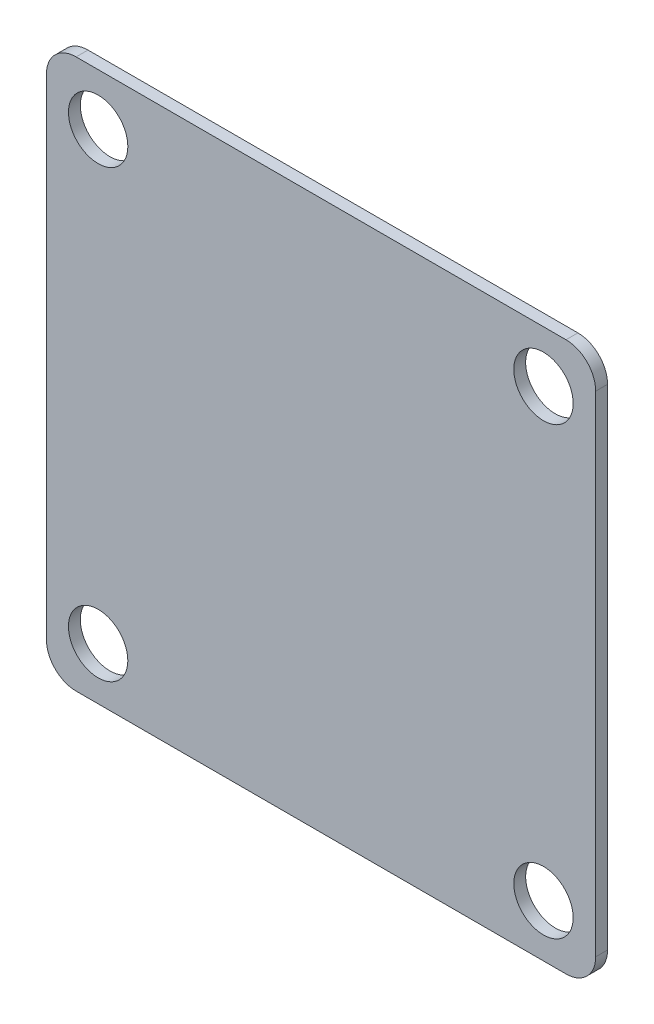
ISO-10303-21;
HEADER;
FILE_DESCRIPTION(('STEP AP214'),'2;1');
FILE_NAME('part.step','',(''),(''),'','','');
FILE_SCHEMA(('AUTOMOTIVE_DESIGN { 1 0 10303 214 1 1 1 1 }'));
ENDSEC;
DATA;
#1=APPLICATION_CONTEXT('core data for automotive mechanical design processes');
#2=APPLICATION_PROTOCOL_DEFINITION('international standard','automotive_design',2000,#1);
#3=PRODUCT_CONTEXT('',#1,'mechanical');
#4=PRODUCT('Part','Part','',(#3));
#5=PRODUCT_RELATED_PRODUCT_CATEGORY('part','',(#4));
#6=PRODUCT_DEFINITION_FORMATION('','',#4);
#7=PRODUCT_DEFINITION_CONTEXT('part definition',#1,'design');
#8=PRODUCT_DEFINITION('design','',#6,#7);
#9=PRODUCT_DEFINITION_SHAPE('','',#8);
#10=(LENGTH_UNIT() NAMED_UNIT(*) SI_UNIT(.MILLI.,.METRE.));
#11=(NAMED_UNIT(*) PLANE_ANGLE_UNIT() SI_UNIT($,.RADIAN.));
#12=(NAMED_UNIT(*) SI_UNIT($,.STERADIAN.) SOLID_ANGLE_UNIT());
#13=UNCERTAINTY_MEASURE_WITH_UNIT(LENGTH_MEASURE(1.E-05),#10,'distance_accuracy_value','');
#14=(GEOMETRIC_REPRESENTATION_CONTEXT(3) GLOBAL_UNCERTAINTY_ASSIGNED_CONTEXT((#13)) GLOBAL_UNIT_ASSIGNED_CONTEXT((#10,
#11,#12)) REPRESENTATION_CONTEXT('',''));
#15=CARTESIAN_POINT('',(0.,0.,0.));
#16=DIRECTION('',(0.,0.,1.));
#17=DIRECTION('',(1.,0.,0.));
#18=AXIS2_PLACEMENT_3D('',#15,#16,#17);
#19=CARTESIAN_POINT('',(-0.00375932556327,0.003762107172325,0.8));
#20=DIRECTION('',(0.,0.,1.));
#21=DIRECTION('',(1.,0.,0.));
#22=AXIS2_PLACEMENT_3D('',#19,#20,#21);
#23=PLANE('',#22);
#24=CARTESIAN_POINT('',(-15.01738997659,-14.98284462349,0.8));
#25=DIRECTION('',(0.,0.,1.));
#26=DIRECTION('',(1.,0.,0.));
#27=AXIS2_PLACEMENT_3D('',#24,#25,#26);
#28=CIRCLE('',#27,2.);
#29=CARTESIAN_POINT('',(-13.01738997659,-14.98284462349,0.8));
#30=VERTEX_POINT('',#29);
#31=EDGE_CURVE('E9',#30,#30,#28,.T.);
#32=ORIENTED_EDGE('',*,*,#31,.F.);
#33=EDGE_LOOP('',(#32));
#34=FACE_BOUND('',#33,.T.);
#35=CARTESIAN_POINT('',(14.982610023409,-14.9828424972,0.8));
#36=DIRECTION('',(0.,0.,1.));
#37=DIRECTION('',(1.,0.,0.));
#38=AXIS2_PLACEMENT_3D('',#35,#36,#37);
#39=CIRCLE('',#38,2.);
#40=CARTESIAN_POINT('',(16.982610023409,-14.9828424972,0.8));
#41=VERTEX_POINT('',#40);
#42=EDGE_CURVE('E43',#41,#41,#39,.T.);
#43=ORIENTED_EDGE('',*,*,#42,.F.);
#44=EDGE_LOOP('',(#43));
#45=FACE_BOUND('',#44,.T.);
#46=CARTESIAN_POINT('',(14.983102471412,15.017157498765,0.8));
#47=DIRECTION('',(0.,0.,1.));
#48=DIRECTION('',(1.,0.,0.));
#49=AXIS2_PLACEMENT_3D('',#46,#47,#48);
#50=CIRCLE('',#49,2.);
#51=CARTESIAN_POINT('',(16.983102471412,15.017157498765,0.8));
#52=VERTEX_POINT('',#51);
#53=EDGE_CURVE('E258',#52,#52,#50,.T.);
#54=ORIENTED_EDGE('',*,*,#53,.F.);
#55=EDGE_LOOP('',(#54));
#56=FACE_BOUND('',#55,.T.);
#57=CARTESIAN_POINT('',(-15.01689752858,15.017155372468,0.8));
#58=DIRECTION('',(0.,0.,1.));
#59=DIRECTION('',(1.,0.,0.));
#60=AXIS2_PLACEMENT_3D('',#57,#58,#59);
#61=CIRCLE('',#60,2.);
#62=CARTESIAN_POINT('',(-13.01689752858,15.017155372468,0.8));
#63=VERTEX_POINT('',#62);
#64=EDGE_CURVE('E251',#63,#63,#61,.T.);
#65=ORIENTED_EDGE('',*,*,#64,.F.);
#66=EDGE_LOOP('',(#65));
#67=FACE_BOUND('',#66,.T.);
#68=DIRECTION('',(0.,-1.,0.));
#69=VECTOR('',#68,1.);
#70=CARTESIAN_POINT('',(-18.5,18.5,0.8));
#71=LINE('',#70,#69);
#72=CARTESIAN_POINT('',(-18.5,16.5,0.8));
#73=VERTEX_POINT('',#72);
#74=CARTESIAN_POINT('',(-18.5,-16.5,0.8));
#75=VERTEX_POINT('',#74);
#76=EDGE_CURVE('E173',#73,#75,#71,.T.);
#77=ORIENTED_EDGE('',*,*,#76,.T.);
#78=CARTESIAN_POINT('',(-16.5,-16.5,0.8));
#79=DIRECTION('',(0.,0.,1.));
#80=DIRECTION('',(0.,-1.,0.));
#81=AXIS2_PLACEMENT_3D('',#78,#79,#80);
#82=CIRCLE('',#81,2.);
#83=CARTESIAN_POINT('',(-16.5,-18.5,0.8));
#84=VERTEX_POINT('',#83);
#85=EDGE_CURVE('E182',#75,#84,#82,.T.);
#86=ORIENTED_EDGE('',*,*,#85,.T.);
#87=DIRECTION('',(1.,0.,0.));
#88=VECTOR('',#87,1.);
#89=CARTESIAN_POINT('',(-18.5,-18.5,0.8));
#90=LINE('',#89,#88);
#91=CARTESIAN_POINT('',(16.5,-18.5,0.8));
#92=VERTEX_POINT('',#91);
#93=EDGE_CURVE('E231',#84,#92,#90,.T.);
#94=ORIENTED_EDGE('',*,*,#93,.T.);
#95=CARTESIAN_POINT('',(16.5,-16.5,0.8));
#96=DIRECTION('',(0.,0.,1.));
#97=DIRECTION('',(0.,-1.,0.));
#98=AXIS2_PLACEMENT_3D('',#95,#96,#97);
#99=CIRCLE('',#98,2.);
#100=CARTESIAN_POINT('',(18.5,-16.5,0.8));
#101=VERTEX_POINT('',#100);
#102=EDGE_CURVE('E144',#92,#101,#99,.T.);
#103=ORIENTED_EDGE('',*,*,#102,.T.);
#104=DIRECTION('',(0.,1.,0.));
#105=VECTOR('',#104,1.);
#106=CARTESIAN_POINT('',(18.5,-18.5,0.8));
#107=LINE('',#106,#105);
#108=CARTESIAN_POINT('',(18.5,16.5,0.8));
#109=VERTEX_POINT('',#108);
#110=EDGE_CURVE('E140',#101,#109,#107,.T.);
#111=ORIENTED_EDGE('',*,*,#110,.T.);
#112=CARTESIAN_POINT('',(16.5,16.5,0.8));
#113=DIRECTION('',(0.,0.,1.));
#114=DIRECTION('',(0.,-1.,0.));
#115=AXIS2_PLACEMENT_3D('',#112,#113,#114);
#116=CIRCLE('',#115,2.);
#117=CARTESIAN_POINT('',(16.5,18.5,0.8));
#118=VERTEX_POINT('',#117);
#119=EDGE_CURVE('E239',#109,#118,#116,.T.);
#120=ORIENTED_EDGE('',*,*,#119,.T.);
#121=DIRECTION('',(-1.,0.,0.));
#122=VECTOR('',#121,1.);
#123=CARTESIAN_POINT('',(18.5,18.5,0.8));
#124=LINE('',#123,#122);
#125=CARTESIAN_POINT('',(-16.5,18.5,0.8));
#126=VERTEX_POINT('',#125);
#127=EDGE_CURVE('E225',#118,#126,#124,.T.);
#128=ORIENTED_EDGE('',*,*,#127,.T.);
#129=CARTESIAN_POINT('',(-16.5,16.5,0.8));
#130=DIRECTION('',(0.,0.,1.));
#131=DIRECTION('',(0.,-1.,0.));
#132=AXIS2_PLACEMENT_3D('',#129,#130,#131);
#133=CIRCLE('',#132,2.);
#134=EDGE_CURVE('E218',#126,#73,#133,.T.);
#135=ORIENTED_EDGE('',*,*,#134,.T.);
#136=EDGE_LOOP('',(#77,#86,#94,#103,#111,#120,#128,#135));
#137=FACE_BOUND('',#136,.T.);
#138=ADVANCED_FACE('F15',(#34,#45,#56,#67,#137),#23,.T.);
#139=CARTESIAN_POINT('',(-15.01738997659,-14.98284462349,0.));
#140=DIRECTION('',(0.,0.,-1.));
#141=DIRECTION('',(1.,0.,0.));
#142=AXIS2_PLACEMENT_3D('',#139,#140,#141);
#143=CYLINDRICAL_SURFACE('',#142,2.);
#144=DIRECTION('',(0.,0.,1.));
#145=VECTOR('',#144,1.);
#146=CARTESIAN_POINT('',(-13.01738997659,-14.98284462349,0.));
#147=LINE('',#146,#145);
#148=CARTESIAN_POINT('',(-13.01738997659,-14.98284462349,0.));
#149=VERTEX_POINT('',#148);
#150=EDGE_CURVE('E24',#149,#30,#147,.T.);
#151=ORIENTED_EDGE('',*,*,#150,.T.);
#152=ORIENTED_EDGE('',*,*,#31,.T.);
#153=ORIENTED_EDGE('',*,*,#150,.F.);
#154=CARTESIAN_POINT('',(-15.01738997659,-14.98284462349,0.));
#155=DIRECTION('',(0.,0.,1.));
#156=DIRECTION('',(1.,0.,0.));
#157=AXIS2_PLACEMENT_3D('',#154,#155,#156);
#158=CIRCLE('',#157,2.);
#159=EDGE_CURVE('E205',#149,#149,#158,.T.);
#160=ORIENTED_EDGE('',*,*,#159,.F.);
#161=EDGE_LOOP('',(#151,#152,#153,#160));
#162=FACE_BOUND('',#161,.T.);
#163=ADVANCED_FACE('F17',(#162),#143,.F.);
#164=CARTESIAN_POINT('',(14.982610023409,-14.9828424972,0.));
#165=DIRECTION('',(0.,0.,-1.));
#166=DIRECTION('',(1.,0.,0.));
#167=AXIS2_PLACEMENT_3D('',#164,#165,#166);
#168=CYLINDRICAL_SURFACE('',#167,2.);
#169=DIRECTION('',(0.,0.,1.));
#170=VECTOR('',#169,1.);
#171=CARTESIAN_POINT('',(16.982610023409,-14.9828424972,0.));
#172=LINE('',#171,#170);
#173=CARTESIAN_POINT('',(16.982610023409,-14.9828424972,0.));
#174=VERTEX_POINT('',#173);
#175=EDGE_CURVE('E214',#174,#41,#172,.T.);
#176=ORIENTED_EDGE('',*,*,#175,.T.);
#177=ORIENTED_EDGE('',*,*,#42,.T.);
#178=ORIENTED_EDGE('',*,*,#175,.F.);
#179=CARTESIAN_POINT('',(14.982610023409,-14.9828424972,0.));
#180=DIRECTION('',(0.,0.,1.));
#181=DIRECTION('',(1.,0.,0.));
#182=AXIS2_PLACEMENT_3D('',#179,#180,#181);
#183=CIRCLE('',#182,2.);
#184=EDGE_CURVE('E201',#174,#174,#183,.T.);
#185=ORIENTED_EDGE('',*,*,#184,.F.);
#186=EDGE_LOOP('',(#176,#177,#178,#185));
#187=FACE_BOUND('',#186,.T.);
#188=ADVANCED_FACE('F379',(#187),#168,.F.);
#189=CARTESIAN_POINT('',(14.983102471412,15.017157498765,0.));
#190=DIRECTION('',(0.,0.,-1.));
#191=DIRECTION('',(1.,0.,0.));
#192=AXIS2_PLACEMENT_3D('',#189,#190,#191);
#193=CYLINDRICAL_SURFACE('',#192,2.);
#194=DIRECTION('',(0.,0.,1.));
#195=VECTOR('',#194,1.);
#196=CARTESIAN_POINT('',(16.983102471412,15.017157498765,0.));
#197=LINE('',#196,#195);
#198=CARTESIAN_POINT('',(16.983102471412,15.017157498765,0.));
#199=VERTEX_POINT('',#198);
#200=EDGE_CURVE('E254',#199,#52,#197,.T.);
#201=ORIENTED_EDGE('',*,*,#200,.T.);
#202=ORIENTED_EDGE('',*,*,#53,.T.);
#203=ORIENTED_EDGE('',*,*,#200,.F.);
#204=CARTESIAN_POINT('',(14.983102471412,15.017157498765,0.));
#205=DIRECTION('',(0.,0.,1.));
#206=DIRECTION('',(1.,0.,0.));
#207=AXIS2_PLACEMENT_3D('',#204,#205,#206);
#208=CIRCLE('',#207,2.);
#209=EDGE_CURVE('E197',#199,#199,#208,.T.);
#210=ORIENTED_EDGE('',*,*,#209,.F.);
#211=EDGE_LOOP('',(#201,#202,#203,#210));
#212=FACE_BOUND('',#211,.T.);
#213=ADVANCED_FACE('F374',(#212),#193,.F.);
#214=CARTESIAN_POINT('',(-15.01689752858,15.017155372468,0.));
#215=DIRECTION('',(0.,0.,-1.));
#216=DIRECTION('',(1.,0.,0.));
#217=AXIS2_PLACEMENT_3D('',#214,#215,#216);
#218=CYLINDRICAL_SURFACE('',#217,2.);
#219=DIRECTION('',(0.,0.,1.));
#220=VECTOR('',#219,1.);
#221=CARTESIAN_POINT('',(-13.01689752858,15.017155372468,0.));
#222=LINE('',#221,#220);
#223=CARTESIAN_POINT('',(-13.01689752858,15.017155372468,0.));
#224=VERTEX_POINT('',#223);
#225=EDGE_CURVE('E247',#224,#63,#222,.T.);
#226=ORIENTED_EDGE('',*,*,#225,.T.);
#227=ORIENTED_EDGE('',*,*,#64,.T.);
#228=ORIENTED_EDGE('',*,*,#225,.F.);
#229=CARTESIAN_POINT('',(-15.01689752858,15.017155372468,0.));
#230=DIRECTION('',(0.,0.,1.));
#231=DIRECTION('',(1.,0.,0.));
#232=AXIS2_PLACEMENT_3D('',#229,#230,#231);
#233=CIRCLE('',#232,2.);
#234=EDGE_CURVE('E190',#224,#224,#233,.T.);
#235=ORIENTED_EDGE('',*,*,#234,.F.);
#236=EDGE_LOOP('',(#226,#227,#228,#235));
#237=FACE_BOUND('',#236,.T.);
#238=ADVANCED_FACE('F276',(#237),#218,.F.);
#239=CARTESIAN_POINT('',(18.5,-18.5,0.));
#240=DIRECTION('',(-1.,0.,0.));
#241=DIRECTION('',(0.,0.,1.));
#242=AXIS2_PLACEMENT_3D('',#239,#240,#241);
#243=PLANE('',#242);
#244=DIRECTION('',(0.,0.,1.));
#245=VECTOR('',#244,1.);
#246=CARTESIAN_POINT('',(18.5,16.5,0.));
#247=LINE('',#246,#245);
#248=CARTESIAN_POINT('',(18.5,16.5,0.));
#249=VERTEX_POINT('',#248);
#250=EDGE_CURVE('E242',#249,#109,#247,.T.);
#251=ORIENTED_EDGE('',*,*,#250,.T.);
#252=ORIENTED_EDGE('',*,*,#110,.F.);
#253=DIRECTION('',(0.,0.,1.));
#254=VECTOR('',#253,1.);
#255=CARTESIAN_POINT('',(18.5,-16.5,0.));
#256=LINE('',#255,#254);
#257=CARTESIAN_POINT('',(18.5,-16.5,0.));
#258=VERTEX_POINT('',#257);
#259=EDGE_CURVE('E133',#258,#101,#256,.T.);
#260=ORIENTED_EDGE('',*,*,#259,.F.);
#261=DIRECTION('',(0.,1.,0.));
#262=VECTOR('',#261,1.);
#263=CARTESIAN_POINT('',(18.5,-18.5,0.));
#264=LINE('',#263,#262);
#265=EDGE_CURVE('E138',#258,#249,#264,.T.);
#266=ORIENTED_EDGE('',*,*,#265,.T.);
#267=EDGE_LOOP('',(#251,#252,#260,#266));
#268=FACE_BOUND('',#267,.T.);
#269=ADVANCED_FACE('F136',(#268),#243,.F.);
#270=CARTESIAN_POINT('',(16.5,16.5,0.));
#271=DIRECTION('',(0.,0.,1.));
#272=DIRECTION('',(1.,0.,0.));
#273=AXIS2_PLACEMENT_3D('',#270,#271,#272);
#274=CYLINDRICAL_SURFACE('',#273,2.);
#275=CARTESIAN_POINT('',(16.5,16.5,0.));
#276=DIRECTION('',(0.,0.,1.));
#277=DIRECTION('',(0.,-1.,0.));
#278=AXIS2_PLACEMENT_3D('',#275,#276,#277);
#279=CIRCLE('',#278,2.);
#280=CARTESIAN_POINT('',(16.5,18.5,0.));
#281=VERTEX_POINT('',#280);
#282=EDGE_CURVE('E162',#249,#281,#279,.T.);
#283=ORIENTED_EDGE('',*,*,#282,.T.);
#284=DIRECTION('',(0.,0.,1.));
#285=VECTOR('',#284,1.);
#286=CARTESIAN_POINT('',(16.5,18.5,0.));
#287=LINE('',#286,#285);
#288=EDGE_CURVE('E145',#281,#118,#287,.T.);
#289=ORIENTED_EDGE('',*,*,#288,.T.);
#290=ORIENTED_EDGE('',*,*,#119,.F.);
#291=ORIENTED_EDGE('',*,*,#250,.F.);
#292=EDGE_LOOP('',(#283,#289,#290,#291));
#293=FACE_BOUND('',#292,.T.);
#294=ADVANCED_FACE('F295',(#293),#274,.T.);
#295=CARTESIAN_POINT('',(16.5,-16.5,0.));
#296=DIRECTION('',(0.,0.,1.));
#297=DIRECTION('',(0.,-1.,0.));
#298=AXIS2_PLACEMENT_3D('',#295,#296,#297);
#299=CYLINDRICAL_SURFACE('',#298,2.);
#300=CARTESIAN_POINT('',(16.5,-16.5,0.));
#301=DIRECTION('',(0.,0.,1.));
#302=DIRECTION('',(0.,-1.,0.));
#303=AXIS2_PLACEMENT_3D('',#300,#301,#302);
#304=CIRCLE('',#303,2.);
#305=CARTESIAN_POINT('',(16.5,-18.5,0.));
#306=VERTEX_POINT('',#305);
#307=EDGE_CURVE('E148',#306,#258,#304,.T.);
#308=ORIENTED_EDGE('',*,*,#307,.T.);
#309=ORIENTED_EDGE('',*,*,#259,.T.);
#310=ORIENTED_EDGE('',*,*,#102,.F.);
#311=DIRECTION('',(0.,0.,1.));
#312=VECTOR('',#311,1.);
#313=CARTESIAN_POINT('',(16.5,-18.5,0.));
#314=LINE('',#313,#312);
#315=EDGE_CURVE('E151',#306,#92,#314,.T.);
#316=ORIENTED_EDGE('',*,*,#315,.F.);
#317=EDGE_LOOP('',(#308,#309,#310,#316));
#318=FACE_BOUND('',#317,.T.);
#319=ADVANCED_FACE('F149',(#318),#299,.T.);
#320=CARTESIAN_POINT('',(18.5,18.5,0.));
#321=DIRECTION('',(0.,-1.,0.));
#322=DIRECTION('',(0.,0.,-1.));
#323=AXIS2_PLACEMENT_3D('',#320,#321,#322);
#324=PLANE('',#323);
#325=DIRECTION('',(0.,0.,1.));
#326=VECTOR('',#325,1.);
#327=CARTESIAN_POINT('',(-16.5,18.5,0.));
#328=LINE('',#327,#326);
#329=CARTESIAN_POINT('',(-16.5,18.5,0.));
#330=VERTEX_POINT('',#329);
#331=EDGE_CURVE('E221',#330,#126,#328,.T.);
#332=ORIENTED_EDGE('',*,*,#331,.T.);
#333=ORIENTED_EDGE('',*,*,#127,.F.);
#334=ORIENTED_EDGE('',*,*,#288,.F.);
#335=DIRECTION('',(-1.,0.,0.));
#336=VECTOR('',#335,1.);
#337=CARTESIAN_POINT('',(18.5,18.5,0.));
#338=LINE('',#337,#336);
#339=EDGE_CURVE('E168',#281,#330,#338,.T.);
#340=ORIENTED_EDGE('',*,*,#339,.T.);
#341=EDGE_LOOP('',(#332,#333,#334,#340));
#342=FACE_BOUND('',#341,.T.);
#343=ADVANCED_FACE('F299',(#342),#324,.F.);
#344=CARTESIAN_POINT('',(-18.5,-18.5,0.));
#345=DIRECTION('',(0.,1.,0.));
#346=DIRECTION('',(1.,0.,0.));
#347=AXIS2_PLACEMENT_3D('',#344,#345,#346);
#348=PLANE('',#347);
#349=ORIENTED_EDGE('',*,*,#315,.T.);
#350=ORIENTED_EDGE('',*,*,#93,.F.);
#351=DIRECTION('',(0.,0.,1.));
#352=VECTOR('',#351,1.);
#353=CARTESIAN_POINT('',(-16.5,-18.5,0.));
#354=LINE('',#353,#352);
#355=CARTESIAN_POINT('',(-16.5,-18.5,0.));
#356=VERTEX_POINT('',#355);
#357=EDGE_CURVE('E178',#356,#84,#354,.T.);
#358=ORIENTED_EDGE('',*,*,#357,.F.);
#359=DIRECTION('',(1.,0.,0.));
#360=VECTOR('',#359,1.);
#361=CARTESIAN_POINT('',(-18.5,-18.5,0.));
#362=LINE('',#361,#360);
#363=EDGE_CURVE('E156',#356,#306,#362,.T.);
#364=ORIENTED_EDGE('',*,*,#363,.T.);
#365=EDGE_LOOP('',(#349,#350,#358,#364));
#366=FACE_BOUND('',#365,.T.);
#367=ADVANCED_FACE('F292',(#366),#348,.F.);
#368=CARTESIAN_POINT('',(-16.5,16.5,0.));
#369=DIRECTION('',(0.,0.,1.));
#370=DIRECTION('',(0.,1.,0.));
#371=AXIS2_PLACEMENT_3D('',#368,#369,#370);
#372=CYLINDRICAL_SURFACE('',#371,2.);
#373=CARTESIAN_POINT('',(-16.5,16.5,0.));
#374=DIRECTION('',(0.,0.,1.));
#375=DIRECTION('',(0.,-1.,0.));
#376=AXIS2_PLACEMENT_3D('',#373,#374,#375);
#377=CIRCLE('',#376,2.);
#378=CARTESIAN_POINT('',(-18.5,16.5,0.));
#379=VERTEX_POINT('',#378);
#380=EDGE_CURVE('E303',#330,#379,#377,.T.);
#381=ORIENTED_EDGE('',*,*,#380,.T.);
#382=DIRECTION('',(0.,0.,1.));
#383=VECTOR('',#382,1.);
#384=CARTESIAN_POINT('',(-18.5,16.5,0.));
#385=LINE('',#384,#383);
#386=EDGE_CURVE('E172',#379,#73,#385,.T.);
#387=ORIENTED_EDGE('',*,*,#386,.T.);
#388=ORIENTED_EDGE('',*,*,#134,.F.);
#389=ORIENTED_EDGE('',*,*,#331,.F.);
#390=EDGE_LOOP('',(#381,#387,#388,#389));
#391=FACE_BOUND('',#390,.T.);
#392=ADVANCED_FACE('F302',(#391),#372,.T.);
#393=CARTESIAN_POINT('',(-16.5,-16.5,0.));
#394=DIRECTION('',(0.,0.,1.));
#395=DIRECTION('',(-1.,0.,0.));
#396=AXIS2_PLACEMENT_3D('',#393,#394,#395);
#397=CYLINDRICAL_SURFACE('',#396,2.);
#398=CARTESIAN_POINT('',(-16.5,-16.5,0.));
#399=DIRECTION('',(0.,0.,1.));
#400=DIRECTION('',(0.,-1.,0.));
#401=AXIS2_PLACEMENT_3D('',#398,#399,#400);
#402=CIRCLE('',#401,2.);
#403=CARTESIAN_POINT('',(-18.5,-16.5,0.));
#404=VERTEX_POINT('',#403);
#405=EDGE_CURVE('E185',#404,#356,#402,.T.);
#406=ORIENTED_EDGE('',*,*,#405,.T.);
#407=ORIENTED_EDGE('',*,*,#357,.T.);
#408=ORIENTED_EDGE('',*,*,#85,.F.);
#409=DIRECTION('',(0.,0.,1.));
#410=VECTOR('',#409,1.);
#411=CARTESIAN_POINT('',(-18.5,-16.5,0.));
#412=LINE('',#411,#410);
#413=EDGE_CURVE('E176',#404,#75,#412,.T.);
#414=ORIENTED_EDGE('',*,*,#413,.F.);
#415=EDGE_LOOP('',(#406,#407,#408,#414));
#416=FACE_BOUND('',#415,.T.);
#417=ADVANCED_FACE('F290',(#416),#397,.T.);
#418=CARTESIAN_POINT('',(-18.5,18.5,0.));
#419=DIRECTION('',(1.,0.,0.));
#420=DIRECTION('',(0.,1.,0.));
#421=AXIS2_PLACEMENT_3D('',#418,#419,#420);
#422=PLANE('',#421);
#423=ORIENTED_EDGE('',*,*,#413,.T.);
#424=ORIENTED_EDGE('',*,*,#76,.F.);
#425=ORIENTED_EDGE('',*,*,#386,.F.);
#426=DIRECTION('',(0.,-1.,0.));
#427=VECTOR('',#426,1.);
#428=CARTESIAN_POINT('',(-18.5,18.5,0.));
#429=LINE('',#428,#427);
#430=EDGE_CURVE('E186',#379,#404,#429,.T.);
#431=ORIENTED_EDGE('',*,*,#430,.T.);
#432=EDGE_LOOP('',(#423,#424,#425,#431));
#433=FACE_BOUND('',#432,.T.);
#434=ADVANCED_FACE('F268',(#433),#422,.F.);
#435=CARTESIAN_POINT('',(-0.00375932556327,0.003762107172325,0.));
#436=DIRECTION('',(0.,0.,1.));
#437=DIRECTION('',(1.,0.,0.));
#438=AXIS2_PLACEMENT_3D('',#435,#436,#437);
#439=PLANE('',#438);
#440=ORIENTED_EDGE('',*,*,#159,.T.);
#441=EDGE_LOOP('',(#440));
#442=FACE_BOUND('',#441,.T.);
#443=ORIENTED_EDGE('',*,*,#184,.T.);
#444=EDGE_LOOP('',(#443));
#445=FACE_BOUND('',#444,.T.);
#446=ORIENTED_EDGE('',*,*,#209,.T.);
#447=EDGE_LOOP('',(#446));
#448=FACE_BOUND('',#447,.T.);
#449=ORIENTED_EDGE('',*,*,#234,.T.);
#450=EDGE_LOOP('',(#449));
#451=FACE_BOUND('',#450,.T.);
#452=ORIENTED_EDGE('',*,*,#380,.F.);
#453=ORIENTED_EDGE('',*,*,#339,.F.);
#454=ORIENTED_EDGE('',*,*,#282,.F.);
#455=ORIENTED_EDGE('',*,*,#265,.F.);
#456=ORIENTED_EDGE('',*,*,#307,.F.);
#457=ORIENTED_EDGE('',*,*,#363,.F.);
#458=ORIENTED_EDGE('',*,*,#405,.F.);
#459=ORIENTED_EDGE('',*,*,#430,.F.);
#460=EDGE_LOOP('',(#452,#453,#454,#455,#456,#457,#458,#459));
#461=FACE_BOUND('',#460,.T.);
#462=ADVANCED_FACE('F159',(#442,#445,#448,#451,#461),#439,.F.);
#463=CLOSED_SHELL('',(#138,#163,#188,#213,#238,#269,#294,#319,#343,#367,#392,#417,#434,#462));
#464=MANIFOLD_SOLID_BREP('B1',#463);
#465=ADVANCED_BREP_SHAPE_REPRESENTATION('',(#18,#464),#14);
#466=SHAPE_DEFINITION_REPRESENTATION(#9,#465);
ENDSEC;
END-ISO-10303-21;
